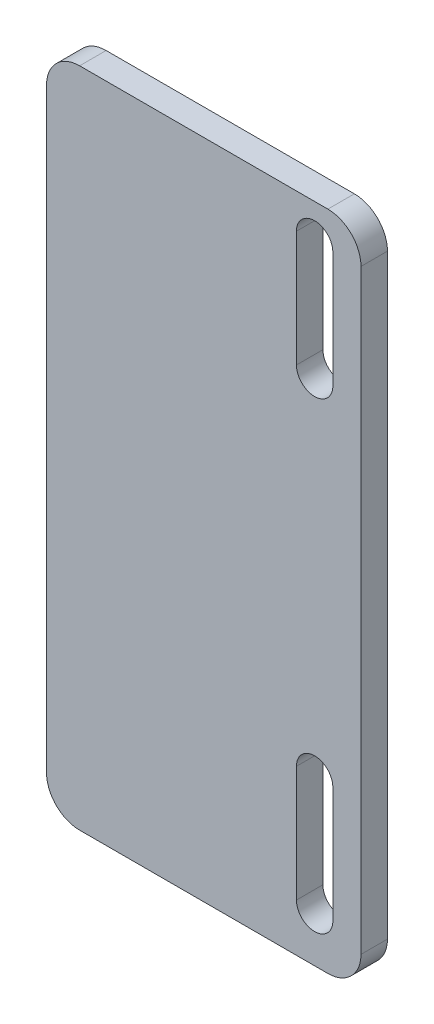
ISO-10303-21;
HEADER;
FILE_DESCRIPTION(('STEP AP214'),'2;1');
FILE_NAME('part.step','',(''),(''),'','','');
FILE_SCHEMA(('AUTOMOTIVE_DESIGN { 1 0 10303 214 1 1 1 1 }'));
ENDSEC;
DATA;
#1=APPLICATION_CONTEXT('core data for automotive mechanical design processes');
#2=APPLICATION_PROTOCOL_DEFINITION('international standard','automotive_design',2000,#1);
#3=PRODUCT_CONTEXT('',#1,'mechanical');
#4=PRODUCT('Part','Part','',(#3));
#5=PRODUCT_RELATED_PRODUCT_CATEGORY('part','',(#4));
#6=PRODUCT_DEFINITION_FORMATION('','',#4);
#7=PRODUCT_DEFINITION_CONTEXT('part definition',#1,'design');
#8=PRODUCT_DEFINITION('design','',#6,#7);
#9=PRODUCT_DEFINITION_SHAPE('','',#8);
#10=(LENGTH_UNIT() NAMED_UNIT(*) SI_UNIT(.MILLI.,.METRE.));
#11=(NAMED_UNIT(*) PLANE_ANGLE_UNIT() SI_UNIT($,.RADIAN.));
#12=(NAMED_UNIT(*) SI_UNIT($,.STERADIAN.) SOLID_ANGLE_UNIT());
#13=UNCERTAINTY_MEASURE_WITH_UNIT(LENGTH_MEASURE(1.E-05),#10,'distance_accuracy_value','');
#14=(GEOMETRIC_REPRESENTATION_CONTEXT(3) GLOBAL_UNCERTAINTY_ASSIGNED_CONTEXT((#13)) GLOBAL_UNIT_ASSIGNED_CONTEXT((#10,
#11,#12)) REPRESENTATION_CONTEXT('',''));
#15=CARTESIAN_POINT('',(0.,0.,0.));
#16=DIRECTION('',(0.,0.,1.));
#17=DIRECTION('',(1.,0.,0.));
#18=AXIS2_PLACEMENT_3D('',#15,#16,#17);
#19=CARTESIAN_POINT('',(0.,0.,1.6));
#20=DIRECTION('',(1.,0.,0.));
#21=DIRECTION('',(0.,0.,-1.));
#22=AXIS2_PLACEMENT_3D('',#19,#20,#21);
#23=PLANE('',#22);
#24=DIRECTION('',(0.,-1.,0.));
#25=VECTOR('',#24,1.);
#26=CARTESIAN_POINT('',(0.,0.,0.));
#27=LINE('',#26,#25);
#28=CARTESIAN_POINT('',(0.,38.,0.));
#29=VERTEX_POINT('',#28);
#30=CARTESIAN_POINT('',(0.,2.,0.));
#31=VERTEX_POINT('',#30);
#32=EDGE_CURVE('E209',#29,#31,#27,.T.);
#33=ORIENTED_EDGE('',*,*,#32,.T.);
#34=DIRECTION('',(0.,0.,-1.));
#35=VECTOR('',#34,1.);
#36=CARTESIAN_POINT('',(0.,2.,1.6));
#37=LINE('',#36,#35);
#38=CARTESIAN_POINT('',(0.,2.,1.6));
#39=VERTEX_POINT('',#38);
#40=EDGE_CURVE('E268',#31,#39,#37,.F.);
#41=ORIENTED_EDGE('',*,*,#40,.T.);
#42=DIRECTION('',(0.,-1.,0.));
#43=VECTOR('',#42,1.);
#44=CARTESIAN_POINT('',(0.,0.,1.6));
#45=LINE('',#44,#43);
#46=CARTESIAN_POINT('',(0.,38.,1.6));
#47=VERTEX_POINT('',#46);
#48=EDGE_CURVE('E216',#47,#39,#45,.T.);
#49=ORIENTED_EDGE('',*,*,#48,.F.);
#50=DIRECTION('',(0.,0.,-1.));
#51=VECTOR('',#50,1.);
#52=CARTESIAN_POINT('',(0.,38.,1.6));
#53=LINE('',#52,#51);
#54=EDGE_CURVE('E265',#47,#29,#53,.T.);
#55=ORIENTED_EDGE('',*,*,#54,.T.);
#56=EDGE_LOOP('',(#33,#41,#49,#55));
#57=FACE_BOUND('',#56,.T.);
#58=ADVANCED_FACE('F35',(#57),#23,.F.);
#59=CARTESIAN_POINT('',(0.,0.,1.6));
#60=DIRECTION('',(0.,1.,0.));
#61=DIRECTION('',(0.,0.,1.));
#62=AXIS2_PLACEMENT_3D('',#59,#60,#61);
#63=PLANE('',#62);
#64=DIRECTION('',(1.,0.,0.));
#65=VECTOR('',#64,1.);
#66=CARTESIAN_POINT('',(0.,0.,0.));
#67=LINE('',#66,#65);
#68=CARTESIAN_POINT('',(2.,0.,0.));
#69=VERTEX_POINT('',#68);
#70=CARTESIAN_POINT('',(17.,0.,0.));
#71=VERTEX_POINT('',#70);
#72=EDGE_CURVE('E232',#69,#71,#67,.T.);
#73=ORIENTED_EDGE('',*,*,#72,.T.);
#74=DIRECTION('',(0.,0.,-1.));
#75=VECTOR('',#74,1.);
#76=CARTESIAN_POINT('',(17.,0.,1.6));
#77=LINE('',#76,#75);
#78=CARTESIAN_POINT('',(17.,0.,1.6));
#79=VERTEX_POINT('',#78);
#80=EDGE_CURVE('E255',#71,#79,#77,.F.);
#81=ORIENTED_EDGE('',*,*,#80,.T.);
#82=DIRECTION('',(1.,0.,0.));
#83=VECTOR('',#82,1.);
#84=CARTESIAN_POINT('',(0.,0.,1.6));
#85=LINE('',#84,#83);
#86=CARTESIAN_POINT('',(2.,0.,1.6));
#87=VERTEX_POINT('',#86);
#88=EDGE_CURVE('E219',#87,#79,#85,.T.);
#89=ORIENTED_EDGE('',*,*,#88,.F.);
#90=DIRECTION('',(0.,0.,-1.));
#91=VECTOR('',#90,1.);
#92=CARTESIAN_POINT('',(2.,0.,1.6));
#93=LINE('',#92,#91);
#94=EDGE_CURVE('E252',#87,#69,#93,.T.);
#95=ORIENTED_EDGE('',*,*,#94,.T.);
#96=EDGE_LOOP('',(#73,#81,#89,#95));
#97=FACE_BOUND('',#96,.T.);
#98=ADVANCED_FACE('F297',(#97),#63,.F.);
#99=CARTESIAN_POINT('',(19.,0.,1.6));
#100=DIRECTION('',(-1.,0.,0.));
#101=DIRECTION('',(0.,0.,1.));
#102=AXIS2_PLACEMENT_3D('',#99,#100,#101);
#103=PLANE('',#102);
#104=DIRECTION('',(0.,1.,0.));
#105=VECTOR('',#104,1.);
#106=CARTESIAN_POINT('',(19.,0.,1.6));
#107=LINE('',#106,#105);
#108=CARTESIAN_POINT('',(19.,2.,1.6));
#109=VERTEX_POINT('',#108);
#110=CARTESIAN_POINT('',(19.,38.,1.6));
#111=VERTEX_POINT('',#110);
#112=EDGE_CURVE('E223',#109,#111,#107,.T.);
#113=ORIENTED_EDGE('',*,*,#112,.F.);
#114=DIRECTION('',(0.,0.,-1.));
#115=VECTOR('',#114,1.);
#116=CARTESIAN_POINT('',(19.,2.,1.6));
#117=LINE('',#116,#115);
#118=CARTESIAN_POINT('',(19.,2.,0.));
#119=VERTEX_POINT('',#118);
#120=EDGE_CURVE('E241',#109,#119,#117,.T.);
#121=ORIENTED_EDGE('',*,*,#120,.T.);
#122=DIRECTION('',(0.,1.,0.));
#123=VECTOR('',#122,1.);
#124=CARTESIAN_POINT('',(19.,0.,0.));
#125=LINE('',#124,#123);
#126=CARTESIAN_POINT('',(19.,38.,0.));
#127=VERTEX_POINT('',#126);
#128=EDGE_CURVE('E235',#119,#127,#125,.T.);
#129=ORIENTED_EDGE('',*,*,#128,.T.);
#130=DIRECTION('',(0.,0.,-1.));
#131=VECTOR('',#130,1.);
#132=CARTESIAN_POINT('',(19.,38.,1.6));
#133=LINE('',#132,#131);
#134=EDGE_CURVE('E229',#127,#111,#133,.F.);
#135=ORIENTED_EDGE('',*,*,#134,.T.);
#136=EDGE_LOOP('',(#113,#121,#129,#135));
#137=FACE_BOUND('',#136,.T.);
#138=ADVANCED_FACE('F305',(#137),#103,.F.);
#139=CARTESIAN_POINT('',(0.,40.,1.6));
#140=DIRECTION('',(0.,-1.,0.));
#141=DIRECTION('',(0.,0.,-1.));
#142=AXIS2_PLACEMENT_3D('',#139,#140,#141);
#143=PLANE('',#142);
#144=DIRECTION('',(-1.,0.,0.));
#145=VECTOR('',#144,1.);
#146=CARTESIAN_POINT('',(0.,40.,0.));
#147=LINE('',#146,#145);
#148=CARTESIAN_POINT('',(17.,40.,0.));
#149=VERTEX_POINT('',#148);
#150=CARTESIAN_POINT('',(2.,40.,0.));
#151=VERTEX_POINT('',#150);
#152=EDGE_CURVE('E220',#149,#151,#147,.T.);
#153=ORIENTED_EDGE('',*,*,#152,.T.);
#154=DIRECTION('',(0.,0.,-1.));
#155=VECTOR('',#154,1.);
#156=CARTESIAN_POINT('',(2.,40.,1.6));
#157=LINE('',#156,#155);
#158=CARTESIAN_POINT('',(2.,40.,1.6));
#159=VERTEX_POINT('',#158);
#160=EDGE_CURVE('E11',#151,#159,#157,.F.);
#161=ORIENTED_EDGE('',*,*,#160,.T.);
#162=DIRECTION('',(-1.,0.,0.));
#163=VECTOR('',#162,1.);
#164=CARTESIAN_POINT('',(0.,40.,1.6));
#165=LINE('',#164,#163);
#166=CARTESIAN_POINT('',(17.,40.,1.6));
#167=VERTEX_POINT('',#166);
#168=EDGE_CURVE('E226',#167,#159,#165,.T.);
#169=ORIENTED_EDGE('',*,*,#168,.F.);
#170=DIRECTION('',(0.,0.,-1.));
#171=VECTOR('',#170,1.);
#172=CARTESIAN_POINT('',(17.,40.,1.6));
#173=LINE('',#172,#171);
#174=EDGE_CURVE('E43',#167,#149,#173,.T.);
#175=ORIENTED_EDGE('',*,*,#174,.T.);
#176=EDGE_LOOP('',(#153,#161,#169,#175));
#177=FACE_BOUND('',#176,.T.);
#178=ADVANCED_FACE('F274',(#177),#143,.F.);
#179=CARTESIAN_POINT('',(0.,0.,1.6));
#180=DIRECTION('',(0.,0.,-1.));
#181=DIRECTION('',(-1.,0.,0.));
#182=AXIS2_PLACEMENT_3D('',#179,#180,#181);
#183=PLANE('',#182);
#184=DIRECTION('',(0.,1.,0.));
#185=VECTOR('',#184,1.);
#186=CARTESIAN_POINT('',(17.2999999999998,30.8933818910976,1.6));
#187=LINE('',#186,#185);
#188=CARTESIAN_POINT('',(17.2999999999998,30.8933818910976,1.6));
#189=VERTEX_POINT('',#188);
#190=CARTESIAN_POINT('',(17.2999999999998,37.8933818910976,1.6));
#191=VERTEX_POINT('',#190);
#192=EDGE_CURVE('E174',#189,#191,#187,.T.);
#193=ORIENTED_EDGE('',*,*,#192,.F.);
#194=CARTESIAN_POINT('',(16.1999999999998,30.8933818910976,1.6));
#195=DIRECTION('',(0.,0.,1.));
#196=DIRECTION('',(1.,0.,0.));
#197=AXIS2_PLACEMENT_3D('',#194,#195,#196);
#198=CIRCLE('',#197,1.1);
#199=CARTESIAN_POINT('',(15.0999999999998,30.8933818910976,1.6));
#200=VERTEX_POINT('',#199);
#201=EDGE_CURVE('E50',#200,#189,#198,.T.);
#202=ORIENTED_EDGE('',*,*,#201,.F.);
#203=DIRECTION('',(0.,-1.,0.));
#204=VECTOR('',#203,1.);
#205=CARTESIAN_POINT('',(15.0999999999998,30.8933818910976,1.6));
#206=LINE('',#205,#204);
#207=CARTESIAN_POINT('',(15.0999999999998,37.8933818910976,1.6));
#208=VERTEX_POINT('',#207);
#209=EDGE_CURVE('E165',#208,#200,#206,.T.);
#210=ORIENTED_EDGE('',*,*,#209,.F.);
#211=CARTESIAN_POINT('',(16.1999999999998,37.8933818910976,1.6));
#212=DIRECTION('',(0.,0.,1.));
#213=DIRECTION('',(1.,0.,0.));
#214=AXIS2_PLACEMENT_3D('',#211,#212,#213);
#215=CIRCLE('',#214,1.1);
#216=EDGE_CURVE('E168',#191,#208,#215,.T.);
#217=ORIENTED_EDGE('',*,*,#216,.F.);
#218=EDGE_LOOP('',(#193,#202,#210,#217));
#219=FACE_BOUND('',#218,.T.);
#220=DIRECTION('',(0.,1.,0.));
#221=VECTOR('',#220,1.);
#222=CARTESIAN_POINT('',(17.2999999999998,2.89338189109756,1.6));
#223=LINE('',#222,#221);
#224=CARTESIAN_POINT('',(17.2999999999998,2.89338189109756,1.6));
#225=VERTEX_POINT('',#224);
#226=CARTESIAN_POINT('',(17.2999999999998,9.89338189109756,1.6));
#227=VERTEX_POINT('',#226);
#228=EDGE_CURVE('E199',#225,#227,#223,.T.);
#229=ORIENTED_EDGE('',*,*,#228,.F.);
#230=CARTESIAN_POINT('',(16.1999999999998,2.89338189109756,1.6));
#231=DIRECTION('',(0.,0.,1.));
#232=DIRECTION('',(1.,0.,0.));
#233=AXIS2_PLACEMENT_3D('',#230,#231,#232);
#234=CIRCLE('',#233,1.1);
#235=CARTESIAN_POINT('',(15.0999999999998,2.89338189109756,1.6));
#236=VERTEX_POINT('',#235);
#237=EDGE_CURVE('E180',#236,#225,#234,.T.);
#238=ORIENTED_EDGE('',*,*,#237,.F.);
#239=DIRECTION('',(0.,-1.,0.));
#240=VECTOR('',#239,1.);
#241=CARTESIAN_POINT('',(15.0999999999998,2.89338189109756,1.6));
#242=LINE('',#241,#240);
#243=CARTESIAN_POINT('',(15.0999999999998,9.89338189109756,1.6));
#244=VERTEX_POINT('',#243);
#245=EDGE_CURVE('E188',#244,#236,#242,.T.);
#246=ORIENTED_EDGE('',*,*,#245,.F.);
#247=CARTESIAN_POINT('',(16.1999999999998,9.89338189109756,1.6));
#248=DIRECTION('',(0.,0.,1.));
#249=DIRECTION('',(1.,0.,0.));
#250=AXIS2_PLACEMENT_3D('',#247,#248,#249);
#251=CIRCLE('',#250,1.1);
#252=EDGE_CURVE('E202',#227,#244,#251,.T.);
#253=ORIENTED_EDGE('',*,*,#252,.F.);
#254=EDGE_LOOP('',(#229,#238,#246,#253));
#255=FACE_BOUND('',#254,.T.);
#256=ORIENTED_EDGE('',*,*,#88,.T.);
#257=CARTESIAN_POINT('',(17.,2.,1.6));
#258=DIRECTION('',(0.,0.,-1.));
#259=DIRECTION('',(-1.,0.,0.));
#260=AXIS2_PLACEMENT_3D('',#257,#258,#259);
#261=CIRCLE('',#260,2.);
#262=EDGE_CURVE('E263',#79,#109,#261,.F.);
#263=ORIENTED_EDGE('',*,*,#262,.T.);
#264=ORIENTED_EDGE('',*,*,#112,.T.);
#265=CARTESIAN_POINT('',(17.,38.,1.6));
#266=DIRECTION('',(0.,0.,-1.));
#267=DIRECTION('',(-1.,0.,0.));
#268=AXIS2_PLACEMENT_3D('',#265,#266,#267);
#269=CIRCLE('',#268,2.);
#270=EDGE_CURVE('E257',#111,#167,#269,.F.);
#271=ORIENTED_EDGE('',*,*,#270,.T.);
#272=ORIENTED_EDGE('',*,*,#168,.T.);
#273=CARTESIAN_POINT('',(2.,38.,1.6));
#274=DIRECTION('',(0.,0.,-1.));
#275=DIRECTION('',(-1.,0.,0.));
#276=AXIS2_PLACEMENT_3D('',#273,#274,#275);
#277=CIRCLE('',#276,2.);
#278=EDGE_CURVE('E259',#159,#47,#277,.F.);
#279=ORIENTED_EDGE('',*,*,#278,.T.);
#280=ORIENTED_EDGE('',*,*,#48,.T.);
#281=CARTESIAN_POINT('',(2.,2.,1.6));
#282=DIRECTION('',(0.,0.,-1.));
#283=DIRECTION('',(-1.,0.,0.));
#284=AXIS2_PLACEMENT_3D('',#281,#282,#283);
#285=CIRCLE('',#284,2.);
#286=EDGE_CURVE('E261',#39,#87,#285,.F.);
#287=ORIENTED_EDGE('',*,*,#286,.T.);
#288=EDGE_LOOP('',(#256,#263,#264,#271,#272,#279,#280,#287));
#289=FACE_BOUND('',#288,.T.);
#290=ADVANCED_FACE('F290',(#219,#255,#289),#183,.F.);
#291=CARTESIAN_POINT('',(0.,0.,0.));
#292=DIRECTION('',(0.,0.,-1.));
#293=DIRECTION('',(-1.,0.,0.));
#294=AXIS2_PLACEMENT_3D('',#291,#292,#293);
#295=PLANE('',#294);
#296=CARTESIAN_POINT('',(16.1999999999998,30.8933818910976,0.));
#297=DIRECTION('',(0.,0.,1.));
#298=DIRECTION('',(1.,0.,0.));
#299=AXIS2_PLACEMENT_3D('',#296,#297,#298);
#300=CIRCLE('',#299,1.1);
#301=CARTESIAN_POINT('',(15.0999999999998,30.8933818910976,0.));
#302=VERTEX_POINT('',#301);
#303=CARTESIAN_POINT('',(17.2999999999998,30.8933818910976,0.));
#304=VERTEX_POINT('',#303);
#305=EDGE_CURVE('E149',#302,#304,#300,.T.);
#306=ORIENTED_EDGE('',*,*,#305,.T.);
#307=DIRECTION('',(0.,1.,0.));
#308=VECTOR('',#307,1.);
#309=CARTESIAN_POINT('',(17.2999999999998,30.8933818910976,0.));
#310=LINE('',#309,#308);
#311=CARTESIAN_POINT('',(17.2999999999998,37.8933818910976,0.));
#312=VERTEX_POINT('',#311);
#313=EDGE_CURVE('E158',#304,#312,#310,.T.);
#314=ORIENTED_EDGE('',*,*,#313,.T.);
#315=CARTESIAN_POINT('',(16.1999999999998,37.8933818910976,0.));
#316=DIRECTION('',(0.,0.,1.));
#317=DIRECTION('',(1.,0.,0.));
#318=AXIS2_PLACEMENT_3D('',#315,#316,#317);
#319=CIRCLE('',#318,1.1);
#320=CARTESIAN_POINT('',(15.0999999999998,37.8933818910976,0.));
#321=VERTEX_POINT('',#320);
#322=EDGE_CURVE('E58',#312,#321,#319,.T.);
#323=ORIENTED_EDGE('',*,*,#322,.T.);
#324=DIRECTION('',(0.,-1.,0.));
#325=VECTOR('',#324,1.);
#326=CARTESIAN_POINT('',(15.0999999999998,30.8933818910976,0.));
#327=LINE('',#326,#325);
#328=EDGE_CURVE('E155',#321,#302,#327,.T.);
#329=ORIENTED_EDGE('',*,*,#328,.T.);
#330=EDGE_LOOP('',(#306,#314,#323,#329));
#331=FACE_BOUND('',#330,.T.);
#332=CARTESIAN_POINT('',(16.1999999999998,2.89338189109756,0.));
#333=DIRECTION('',(0.,0.,1.));
#334=DIRECTION('',(1.,0.,0.));
#335=AXIS2_PLACEMENT_3D('',#332,#333,#334);
#336=CIRCLE('',#335,1.1);
#337=CARTESIAN_POINT('',(15.0999999999998,2.89338189109756,0.));
#338=VERTEX_POINT('',#337);
#339=CARTESIAN_POINT('',(17.2999999999998,2.89338189109756,0.));
#340=VERTEX_POINT('',#339);
#341=EDGE_CURVE('E184',#338,#340,#336,.T.);
#342=ORIENTED_EDGE('',*,*,#341,.T.);
#343=DIRECTION('',(0.,1.,0.));
#344=VECTOR('',#343,1.);
#345=CARTESIAN_POINT('',(17.2999999999998,2.89338189109756,0.));
#346=LINE('',#345,#344);
#347=CARTESIAN_POINT('',(17.2999999999998,9.89338189109756,0.));
#348=VERTEX_POINT('',#347);
#349=EDGE_CURVE('E187',#340,#348,#346,.T.);
#350=ORIENTED_EDGE('',*,*,#349,.T.);
#351=CARTESIAN_POINT('',(16.1999999999998,9.89338189109756,0.));
#352=DIRECTION('',(0.,0.,1.));
#353=DIRECTION('',(1.,0.,0.));
#354=AXIS2_PLACEMENT_3D('',#351,#352,#353);
#355=CIRCLE('',#354,1.1);
#356=CARTESIAN_POINT('',(15.0999999999998,9.89338189109756,0.));
#357=VERTEX_POINT('',#356);
#358=EDGE_CURVE('E191',#348,#357,#355,.T.);
#359=ORIENTED_EDGE('',*,*,#358,.T.);
#360=DIRECTION('',(0.,-1.,0.));
#361=VECTOR('',#360,1.);
#362=CARTESIAN_POINT('',(15.0999999999998,2.89338189109756,0.));
#363=LINE('',#362,#361);
#364=EDGE_CURVE('E194',#357,#338,#363,.T.);
#365=ORIENTED_EDGE('',*,*,#364,.T.);
#366=EDGE_LOOP('',(#342,#350,#359,#365));
#367=FACE_BOUND('',#366,.T.);
#368=ORIENTED_EDGE('',*,*,#128,.F.);
#369=CARTESIAN_POINT('',(17.,2.,0.));
#370=DIRECTION('',(0.,0.,-1.));
#371=DIRECTION('',(-1.,0.,0.));
#372=AXIS2_PLACEMENT_3D('',#369,#370,#371);
#373=CIRCLE('',#372,2.);
#374=EDGE_CURVE('E250',#119,#71,#373,.T.);
#375=ORIENTED_EDGE('',*,*,#374,.T.);
#376=ORIENTED_EDGE('',*,*,#72,.F.);
#377=CARTESIAN_POINT('',(2.,2.,0.));
#378=DIRECTION('',(0.,0.,-1.));
#379=DIRECTION('',(-1.,0.,0.));
#380=AXIS2_PLACEMENT_3D('',#377,#378,#379);
#381=CIRCLE('',#380,2.);
#382=EDGE_CURVE('E248',#69,#31,#381,.T.);
#383=ORIENTED_EDGE('',*,*,#382,.T.);
#384=ORIENTED_EDGE('',*,*,#32,.F.);
#385=CARTESIAN_POINT('',(2.,38.,0.));
#386=DIRECTION('',(0.,0.,-1.));
#387=DIRECTION('',(-1.,0.,0.));
#388=AXIS2_PLACEMENT_3D('',#385,#386,#387);
#389=CIRCLE('',#388,2.);
#390=EDGE_CURVE('E246',#29,#151,#389,.T.);
#391=ORIENTED_EDGE('',*,*,#390,.T.);
#392=ORIENTED_EDGE('',*,*,#152,.F.);
#393=CARTESIAN_POINT('',(17.,38.,0.));
#394=DIRECTION('',(0.,0.,-1.));
#395=DIRECTION('',(-1.,0.,0.));
#396=AXIS2_PLACEMENT_3D('',#393,#394,#395);
#397=CIRCLE('',#396,2.);
#398=EDGE_CURVE('E244',#149,#127,#397,.T.);
#399=ORIENTED_EDGE('',*,*,#398,.T.);
#400=EDGE_LOOP('',(#368,#375,#376,#383,#384,#391,#392,#399));
#401=FACE_BOUND('',#400,.T.);
#402=ADVANCED_FACE('F162',(#331,#367,#401),#295,.T.);
#403=CARTESIAN_POINT('',(17.,2.,1.6));
#404=DIRECTION('',(0.,0.,-1.));
#405=DIRECTION('',(-1.,0.,0.));
#406=AXIS2_PLACEMENT_3D('',#403,#404,#405);
#407=CYLINDRICAL_SURFACE('',#406,2.);
#408=ORIENTED_EDGE('',*,*,#262,.F.);
#409=ORIENTED_EDGE('',*,*,#80,.F.);
#410=ORIENTED_EDGE('',*,*,#374,.F.);
#411=ORIENTED_EDGE('',*,*,#120,.F.);
#412=EDGE_LOOP('',(#408,#409,#410,#411));
#413=FACE_BOUND('',#412,.T.);
#414=ADVANCED_FACE('F302',(#413),#407,.T.);
#415=CARTESIAN_POINT('',(2.,2.,1.6));
#416=DIRECTION('',(0.,0.,-1.));
#417=DIRECTION('',(-1.,0.,0.));
#418=AXIS2_PLACEMENT_3D('',#415,#416,#417);
#419=CYLINDRICAL_SURFACE('',#418,2.);
#420=ORIENTED_EDGE('',*,*,#286,.F.);
#421=ORIENTED_EDGE('',*,*,#40,.F.);
#422=ORIENTED_EDGE('',*,*,#382,.F.);
#423=ORIENTED_EDGE('',*,*,#94,.F.);
#424=EDGE_LOOP('',(#420,#421,#422,#423));
#425=FACE_BOUND('',#424,.T.);
#426=ADVANCED_FACE('F294',(#425),#419,.T.);
#427=CARTESIAN_POINT('',(2.,38.,1.6));
#428=DIRECTION('',(0.,0.,-1.));
#429=DIRECTION('',(-1.,0.,0.));
#430=AXIS2_PLACEMENT_3D('',#427,#428,#429);
#431=CYLINDRICAL_SURFACE('',#430,2.);
#432=ORIENTED_EDGE('',*,*,#278,.F.);
#433=ORIENTED_EDGE('',*,*,#160,.F.);
#434=ORIENTED_EDGE('',*,*,#390,.F.);
#435=ORIENTED_EDGE('',*,*,#54,.F.);
#436=EDGE_LOOP('',(#432,#433,#434,#435));
#437=FACE_BOUND('',#436,.T.);
#438=ADVANCED_FACE('F284',(#437),#431,.T.);
#439=CARTESIAN_POINT('',(17.,38.,1.6));
#440=DIRECTION('',(0.,0.,-1.));
#441=DIRECTION('',(-1.,0.,0.));
#442=AXIS2_PLACEMENT_3D('',#439,#440,#441);
#443=CYLINDRICAL_SURFACE('',#442,2.);
#444=ORIENTED_EDGE('',*,*,#270,.F.);
#445=ORIENTED_EDGE('',*,*,#134,.F.);
#446=ORIENTED_EDGE('',*,*,#398,.F.);
#447=ORIENTED_EDGE('',*,*,#174,.F.);
#448=EDGE_LOOP('',(#444,#445,#446,#447));
#449=FACE_BOUND('',#448,.T.);
#450=ADVANCED_FACE('F37',(#449),#443,.T.);
#451=CARTESIAN_POINT('',(16.1999999999998,2.89338189109756,0.));
#452=DIRECTION('',(0.,0.,1.));
#453=DIRECTION('',(1.,0.,0.));
#454=AXIS2_PLACEMENT_3D('',#451,#452,#453);
#455=CYLINDRICAL_SURFACE('',#454,1.1);
#456=ORIENTED_EDGE('',*,*,#237,.T.);
#457=DIRECTION('',(0.,0.,1.));
#458=VECTOR('',#457,1.);
#459=CARTESIAN_POINT('',(17.2999999999998,2.89338189109756,0.));
#460=LINE('',#459,#458);
#461=EDGE_CURVE('E197',#340,#225,#460,.T.);
#462=ORIENTED_EDGE('',*,*,#461,.F.);
#463=ORIENTED_EDGE('',*,*,#341,.F.);
#464=DIRECTION('',(0.,0.,1.));
#465=VECTOR('',#464,1.);
#466=CARTESIAN_POINT('',(15.0999999999998,2.89338189109756,0.));
#467=LINE('',#466,#465);
#468=EDGE_CURVE('E207',#338,#236,#467,.T.);
#469=ORIENTED_EDGE('',*,*,#468,.T.);
#470=EDGE_LOOP('',(#456,#462,#463,#469));
#471=FACE_BOUND('',#470,.T.);
#472=ADVANCED_FACE('F308',(#471),#455,.F.);
#473=CARTESIAN_POINT('',(15.0999999999998,2.89338189109756,0.));
#474=DIRECTION('',(-1.,0.,0.));
#475=DIRECTION('',(0.,0.,1.));
#476=AXIS2_PLACEMENT_3D('',#473,#474,#475);
#477=PLANE('',#476);
#478=ORIENTED_EDGE('',*,*,#245,.T.);
#479=ORIENTED_EDGE('',*,*,#468,.F.);
#480=ORIENTED_EDGE('',*,*,#364,.F.);
#481=DIRECTION('',(0.,0.,1.));
#482=VECTOR('',#481,1.);
#483=CARTESIAN_POINT('',(15.0999999999998,9.89338189109756,0.));
#484=LINE('',#483,#482);
#485=EDGE_CURVE('E210',#357,#244,#484,.T.);
#486=ORIENTED_EDGE('',*,*,#485,.T.);
#487=EDGE_LOOP('',(#478,#479,#480,#486));
#488=FACE_BOUND('',#487,.T.);
#489=ADVANCED_FACE('F313',(#488),#477,.F.);
#490=CARTESIAN_POINT('',(16.1999999999998,9.89338189109756,0.));
#491=DIRECTION('',(0.,0.,1.));
#492=DIRECTION('',(1.,0.,0.));
#493=AXIS2_PLACEMENT_3D('',#490,#491,#492);
#494=CYLINDRICAL_SURFACE('',#493,1.1);
#495=ORIENTED_EDGE('',*,*,#252,.T.);
#496=ORIENTED_EDGE('',*,*,#485,.F.);
#497=ORIENTED_EDGE('',*,*,#358,.F.);
#498=DIRECTION('',(0.,0.,1.));
#499=VECTOR('',#498,1.);
#500=CARTESIAN_POINT('',(17.2999999999998,9.89338189109756,0.));
#501=LINE('',#500,#499);
#502=EDGE_CURVE('E212',#348,#227,#501,.T.);
#503=ORIENTED_EDGE('',*,*,#502,.T.);
#504=EDGE_LOOP('',(#495,#496,#497,#503));
#505=FACE_BOUND('',#504,.T.);
#506=ADVANCED_FACE('F374',(#505),#494,.F.);
#507=CARTESIAN_POINT('',(17.2999999999998,2.89338189109756,0.));
#508=DIRECTION('',(1.,0.,0.));
#509=DIRECTION('',(0.,0.,-1.));
#510=AXIS2_PLACEMENT_3D('',#507,#508,#509);
#511=PLANE('',#510);
#512=ORIENTED_EDGE('',*,*,#228,.T.);
#513=ORIENTED_EDGE('',*,*,#502,.F.);
#514=ORIENTED_EDGE('',*,*,#349,.F.);
#515=ORIENTED_EDGE('',*,*,#461,.T.);
#516=EDGE_LOOP('',(#512,#513,#514,#515));
#517=FACE_BOUND('',#516,.T.);
#518=ADVANCED_FACE('F384',(#517),#511,.F.);
#519=CARTESIAN_POINT('',(16.1999999999998,30.8933818910976,0.));
#520=DIRECTION('',(0.,0.,1.));
#521=DIRECTION('',(1.,0.,0.));
#522=AXIS2_PLACEMENT_3D('',#519,#520,#521);
#523=CYLINDRICAL_SURFACE('',#522,1.1);
#524=ORIENTED_EDGE('',*,*,#201,.T.);
#525=DIRECTION('',(0.,0.,1.));
#526=VECTOR('',#525,1.);
#527=CARTESIAN_POINT('',(17.2999999999998,30.8933818910976,0.));
#528=LINE('',#527,#526);
#529=EDGE_CURVE('E145',#304,#189,#528,.T.);
#530=ORIENTED_EDGE('',*,*,#529,.F.);
#531=ORIENTED_EDGE('',*,*,#305,.F.);
#532=DIRECTION('',(0.,0.,1.));
#533=VECTOR('',#532,1.);
#534=CARTESIAN_POINT('',(15.0999999999998,30.8933818910976,0.));
#535=LINE('',#534,#533);
#536=EDGE_CURVE('E178',#302,#200,#535,.T.);
#537=ORIENTED_EDGE('',*,*,#536,.T.);
#538=EDGE_LOOP('',(#524,#530,#531,#537));
#539=FACE_BOUND('',#538,.T.);
#540=ADVANCED_FACE('F147',(#539),#523,.F.);
#541=CARTESIAN_POINT('',(15.0999999999998,30.8933818910976,0.));
#542=DIRECTION('',(-1.,0.,0.));
#543=DIRECTION('',(0.,0.,1.));
#544=AXIS2_PLACEMENT_3D('',#541,#542,#543);
#545=PLANE('',#544);
#546=ORIENTED_EDGE('',*,*,#209,.T.);
#547=ORIENTED_EDGE('',*,*,#536,.F.);
#548=ORIENTED_EDGE('',*,*,#328,.F.);
#549=DIRECTION('',(0.,0.,1.));
#550=VECTOR('',#549,1.);
#551=CARTESIAN_POINT('',(15.0999999999998,37.8933818910976,0.));
#552=LINE('',#551,#550);
#553=EDGE_CURVE('E181',#321,#208,#552,.T.);
#554=ORIENTED_EDGE('',*,*,#553,.T.);
#555=EDGE_LOOP('',(#546,#547,#548,#554));
#556=FACE_BOUND('',#555,.T.);
#557=ADVANCED_FACE('F403',(#556),#545,.F.);
#558=CARTESIAN_POINT('',(16.1999999999998,37.8933818910976,0.));
#559=DIRECTION('',(0.,0.,1.));
#560=DIRECTION('',(1.,0.,0.));
#561=AXIS2_PLACEMENT_3D('',#558,#559,#560);
#562=CYLINDRICAL_SURFACE('',#561,1.1);
#563=ORIENTED_EDGE('',*,*,#216,.T.);
#564=ORIENTED_EDGE('',*,*,#553,.F.);
#565=ORIENTED_EDGE('',*,*,#322,.F.);
#566=DIRECTION('',(0.,0.,1.));
#567=VECTOR('',#566,1.);
#568=CARTESIAN_POINT('',(17.2999999999998,37.8933818910976,0.));
#569=LINE('',#568,#567);
#570=EDGE_CURVE('E154',#312,#191,#569,.T.);
#571=ORIENTED_EDGE('',*,*,#570,.T.);
#572=EDGE_LOOP('',(#563,#564,#565,#571));
#573=FACE_BOUND('',#572,.T.);
#574=ADVANCED_FACE('F412',(#573),#562,.F.);
#575=CARTESIAN_POINT('',(17.2999999999998,30.8933818910976,0.));
#576=DIRECTION('',(1.,0.,0.));
#577=DIRECTION('',(0.,0.,-1.));
#578=AXIS2_PLACEMENT_3D('',#575,#576,#577);
#579=PLANE('',#578);
#580=ORIENTED_EDGE('',*,*,#192,.T.);
#581=ORIENTED_EDGE('',*,*,#570,.F.);
#582=ORIENTED_EDGE('',*,*,#313,.F.);
#583=ORIENTED_EDGE('',*,*,#529,.T.);
#584=EDGE_LOOP('',(#580,#581,#582,#583));
#585=FACE_BOUND('',#584,.T.);
#586=ADVANCED_FACE('F159',(#585),#579,.F.);
#587=CLOSED_SHELL('',(#58,#98,#138,#178,#290,#402,#414,#426,#438,#450,#472,#489,#506,#518,#540,
#557,#574,#586));
#588=MANIFOLD_SOLID_BREP('B2',#587);
#589=ADVANCED_BREP_SHAPE_REPRESENTATION('',(#18,#588),#14);
#590=SHAPE_DEFINITION_REPRESENTATION(#9,#589);
ENDSEC;
END-ISO-10303-21;
